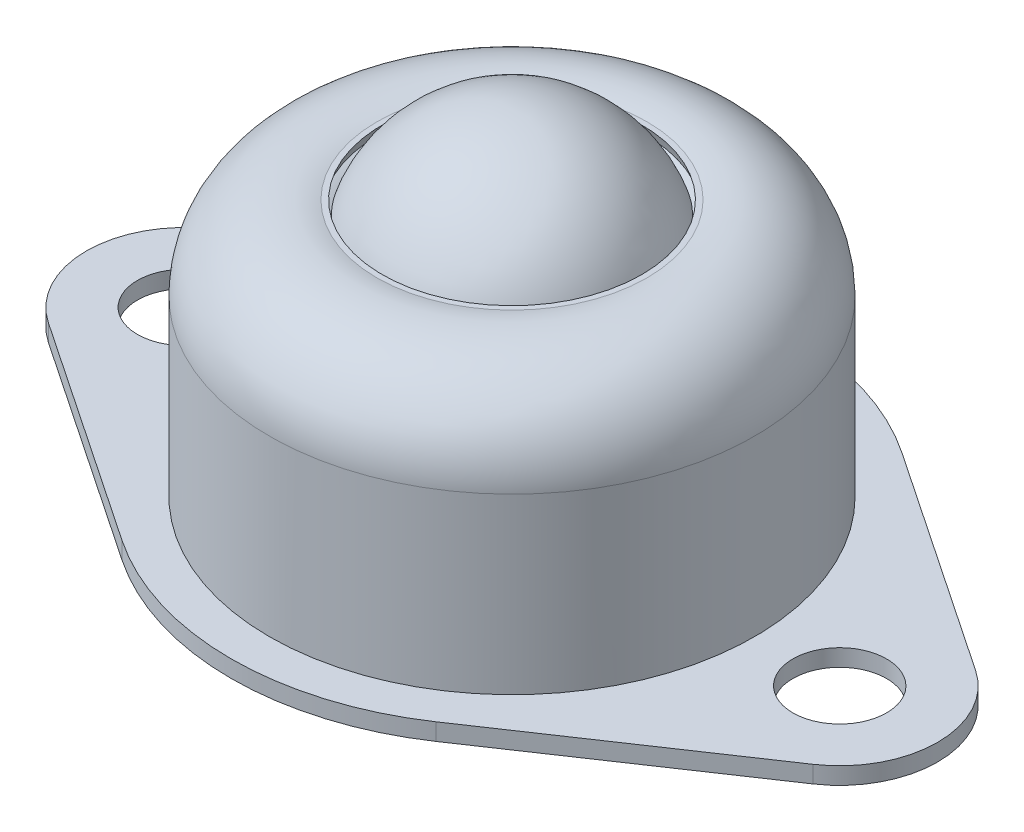
ISO-10303-21;
HEADER;
FILE_DESCRIPTION(('STEP AP214'),'2;1');
FILE_NAME('part.step','',(''),(''),'','','');
FILE_SCHEMA(('AUTOMOTIVE_DESIGN { 1 0 10303 214 1 1 1 1 }'));
ENDSEC;
DATA;
#1=APPLICATION_CONTEXT('core data for automotive mechanical design processes');
#2=APPLICATION_PROTOCOL_DEFINITION('international standard','automotive_design',2000,#1);
#3=PRODUCT_CONTEXT('',#1,'mechanical');
#4=PRODUCT('Part','Part','',(#3));
#5=PRODUCT_RELATED_PRODUCT_CATEGORY('part','',(#4));
#6=PRODUCT_DEFINITION_FORMATION('','',#4);
#7=PRODUCT_DEFINITION_CONTEXT('part definition',#1,'design');
#8=PRODUCT_DEFINITION('design','',#6,#7);
#9=PRODUCT_DEFINITION_SHAPE('','',#8);
#10=(LENGTH_UNIT() NAMED_UNIT(*) SI_UNIT(.MILLI.,.METRE.));
#11=(NAMED_UNIT(*) PLANE_ANGLE_UNIT() SI_UNIT($,.RADIAN.));
#12=(NAMED_UNIT(*) SI_UNIT($,.STERADIAN.) SOLID_ANGLE_UNIT());
#13=UNCERTAINTY_MEASURE_WITH_UNIT(LENGTH_MEASURE(1.E-05),#10,'distance_accuracy_value','');
#14=(GEOMETRIC_REPRESENTATION_CONTEXT(3) GLOBAL_UNCERTAINTY_ASSIGNED_CONTEXT((#13)) GLOBAL_UNIT_ASSIGNED_CONTEXT((#10,
#11,#12)) REPRESENTATION_CONTEXT('',''));
#15=CARTESIAN_POINT('',(0.,0.,0.));
#16=DIRECTION('',(0.,0.,1.));
#17=DIRECTION('',(1.,0.,0.));
#18=AXIS2_PLACEMENT_3D('',#15,#16,#17);
#19=CARTESIAN_POINT('',(0.,12.7625,0.));
#20=DIRECTION('',(0.,1.,0.));
#21=DIRECTION('',(1.,0.,0.));
#22=AXIS2_PLACEMENT_3D('',#19,#20,#21);
#23=SPHERICAL_SURFACE('',#22,7.9375);
#24=CARTESIAN_POINT('',(0.,20.7,0.));
#25=VERTEX_POINT('',#24);
#26=VERTEX_LOOP('',#25);
#27=FACE_BOUND('',#26,.T.);
#28=ADVANCED_FACE('F43',(#27),#23,.T.);
#29=CLOSED_SHELL('',(#28));
#30=MANIFOLD_SOLID_BREP('B2',#29);
#31=CARTESIAN_POINT('',(0.,1.,0.));
#32=DIRECTION('',(0.,1.,0.));
#33=DIRECTION('',(0.,0.,1.));
#34=AXIS2_PLACEMENT_3D('',#31,#32,#33);
#35=PLANE('',#34);
#36=CARTESIAN_POINT('',(0.,1.,0.));
#37=DIRECTION('',(0.,1.,0.));
#38=DIRECTION('',(0.,0.,1.));
#39=AXIS2_PLACEMENT_3D('',#36,#37,#38);
#40=CIRCLE('',#39,14.25);
#41=CARTESIAN_POINT('',(0.,1.,14.25));
#42=VERTEX_POINT('',#41);
#43=EDGE_CURVE('E212',#42,#42,#40,.F.);
#44=ORIENTED_EDGE('',*,*,#43,.T.);
#45=EDGE_LOOP('',(#44));
#46=FACE_BOUND('',#45,.T.);
#47=CARTESIAN_POINT('',(-19.25,1.,0.));
#48=DIRECTION('',(0.,1.,0.));
#49=DIRECTION('',(0.,0.,1.));
#50=AXIS2_PLACEMENT_3D('',#47,#48,#49);
#51=CIRCLE('',#50,2.75);
#52=CARTESIAN_POINT('',(-19.25,1.,2.75));
#53=VERTEX_POINT('',#52);
#54=EDGE_CURVE('E157',#53,#53,#51,.T.);
#55=ORIENTED_EDGE('',*,*,#54,.F.);
#56=EDGE_LOOP('',(#55));
#57=FACE_BOUND('',#56,.T.);
#58=CARTESIAN_POINT('',(0.,1.,0.));
#59=DIRECTION('',(0.,1.,0.));
#60=DIRECTION('',(0.,0.,1.));
#61=AXIS2_PLACEMENT_3D('',#58,#59,#60);
#62=CIRCLE('',#61,16.5);
#63=CARTESIAN_POINT('',(9.2142857142857,1.,-13.6874737908611));
#64=VERTEX_POINT('',#63);
#65=CARTESIAN_POINT('',(-9.2142857142857,1.,-13.6874737908611));
#66=VERTEX_POINT('',#65);
#67=EDGE_CURVE('E168',#64,#66,#62,.T.);
#68=ORIENTED_EDGE('',*,*,#67,.T.);
#69=DIRECTION('',(-0.829543866112796,0.,0.558441558441557));
#70=VECTOR('',#69,1.);
#71=CARTESIAN_POINT('',(-9.2142857142857,1.,-13.6874737908611));
#72=LINE('',#71,#70);
#73=CARTESIAN_POINT('',(-22.461038961039,1.,-4.76987723014859));
#74=VERTEX_POINT('',#73);
#75=EDGE_CURVE('E116',#66,#74,#72,.T.);
#76=ORIENTED_EDGE('',*,*,#75,.T.);
#77=CARTESIAN_POINT('',(-19.25,1.,0.));
#78=DIRECTION('',(0.,1.,0.));
#79=DIRECTION('',(0.,0.,1.));
#80=AXIS2_PLACEMENT_3D('',#77,#78,#79);
#81=CIRCLE('',#80,5.75000000000002);
#82=CARTESIAN_POINT('',(-22.461038961039,1.,4.76987723014859));
#83=VERTEX_POINT('',#82);
#84=EDGE_CURVE('E184',#74,#83,#81,.T.);
#85=ORIENTED_EDGE('',*,*,#84,.T.);
#86=DIRECTION('',(0.829543866112796,0.,0.558441558441557));
#87=VECTOR('',#86,1.);
#88=CARTESIAN_POINT('',(-22.461038961039,1.,4.76987723014859));
#89=LINE('',#88,#87);
#90=CARTESIAN_POINT('',(-9.2142857142857,1.,13.6874737908611));
#91=VERTEX_POINT('',#90);
#92=EDGE_CURVE('E197',#83,#91,#89,.T.);
#93=ORIENTED_EDGE('',*,*,#92,.T.);
#94=CARTESIAN_POINT('',(0.,1.,0.));
#95=DIRECTION('',(0.,1.,0.));
#96=DIRECTION('',(0.,0.,1.));
#97=AXIS2_PLACEMENT_3D('',#94,#95,#96);
#98=CIRCLE('',#97,16.5);
#99=CARTESIAN_POINT('',(9.2142857142857,1.,13.6874737908611));
#100=VERTEX_POINT('',#99);
#101=EDGE_CURVE('E135',#91,#100,#98,.T.);
#102=ORIENTED_EDGE('',*,*,#101,.T.);
#103=DIRECTION('',(0.829543866112796,0.,-0.558441558441557));
#104=VECTOR('',#103,1.);
#105=CARTESIAN_POINT('',(9.2142857142857,1.,13.6874737908611));
#106=LINE('',#105,#104);
#107=CARTESIAN_POINT('',(22.461038961039,1.,4.76987723014859));
#108=VERTEX_POINT('',#107);
#109=EDGE_CURVE('E129',#100,#108,#106,.T.);
#110=ORIENTED_EDGE('',*,*,#109,.T.);
#111=CARTESIAN_POINT('',(19.25,1.,0.));
#112=DIRECTION('',(0.,1.,0.));
#113=DIRECTION('',(0.,0.,-1.));
#114=AXIS2_PLACEMENT_3D('',#111,#112,#113);
#115=CIRCLE('',#114,5.75000000000002);
#116=CARTESIAN_POINT('',(22.461038961039,1.,-4.76987723014859));
#117=VERTEX_POINT('',#116);
#118=EDGE_CURVE('E133',#108,#117,#115,.T.);
#119=ORIENTED_EDGE('',*,*,#118,.T.);
#120=DIRECTION('',(-0.829543866112796,0.,-0.558441558441557));
#121=VECTOR('',#120,1.);
#122=CARTESIAN_POINT('',(22.461038961039,1.,-4.76987723014859));
#123=LINE('',#122,#121);
#124=EDGE_CURVE('E73',#117,#64,#123,.T.);
#125=ORIENTED_EDGE('',*,*,#124,.T.);
#126=EDGE_LOOP('',(#68,#76,#85,#93,#102,#110,#119,#125));
#127=FACE_BOUND('',#126,.T.);
#128=CARTESIAN_POINT('',(19.25,1.,0.));
#129=DIRECTION('',(0.,1.,0.));
#130=DIRECTION('',(0.,0.,1.));
#131=AXIS2_PLACEMENT_3D('',#128,#129,#130);
#132=CIRCLE('',#131,2.75);
#133=CARTESIAN_POINT('',(19.25,1.,2.75));
#134=VERTEX_POINT('',#133);
#135=EDGE_CURVE('E206',#134,#134,#132,.T.);
#136=ORIENTED_EDGE('',*,*,#135,.F.);
#137=EDGE_LOOP('',(#136));
#138=FACE_BOUND('',#137,.T.);
#139=ADVANCED_FACE('F55',(#46,#57,#127,#138),#35,.T.);
#140=CARTESIAN_POINT('',(0.,0.,0.));
#141=DIRECTION('',(0.,1.,0.));
#142=DIRECTION('',(0.,0.,1.));
#143=AXIS2_PLACEMENT_3D('',#140,#141,#142);
#144=PLANE('',#143);
#145=CARTESIAN_POINT('',(0.,0.,0.));
#146=DIRECTION('',(0.,1.,0.));
#147=DIRECTION('',(0.,0.,1.));
#148=AXIS2_PLACEMENT_3D('',#145,#146,#147);
#149=CIRCLE('',#148,16.5);
#150=CARTESIAN_POINT('',(9.2142857142857,0.,-13.6874737908611));
#151=VERTEX_POINT('',#150);
#152=CARTESIAN_POINT('',(-9.2142857142857,0.,-13.6874737908611));
#153=VERTEX_POINT('',#152);
#154=EDGE_CURVE('E153',#151,#153,#149,.T.);
#155=ORIENTED_EDGE('',*,*,#154,.F.);
#156=DIRECTION('',(-0.829543866112796,0.,-0.558441558441557));
#157=VECTOR('',#156,1.);
#158=CARTESIAN_POINT('',(22.461038961039,0.,-4.76987723014859));
#159=LINE('',#158,#157);
#160=CARTESIAN_POINT('',(22.461038961039,0.,-4.76987723014859));
#161=VERTEX_POINT('',#160);
#162=EDGE_CURVE('E108',#161,#151,#159,.T.);
#163=ORIENTED_EDGE('',*,*,#162,.F.);
#164=CARTESIAN_POINT('',(19.25,0.,0.));
#165=DIRECTION('',(0.,1.,0.));
#166=DIRECTION('',(0.,0.,-1.));
#167=AXIS2_PLACEMENT_3D('',#164,#165,#166);
#168=CIRCLE('',#167,5.75000000000002);
#169=CARTESIAN_POINT('',(22.461038961039,0.,4.76987723014859));
#170=VERTEX_POINT('',#169);
#171=EDGE_CURVE('E102',#170,#161,#168,.T.);
#172=ORIENTED_EDGE('',*,*,#171,.F.);
#173=DIRECTION('',(0.829543866112796,0.,-0.558441558441557));
#174=VECTOR('',#173,1.);
#175=CARTESIAN_POINT('',(9.2142857142857,0.,13.6874737908611));
#176=LINE('',#175,#174);
#177=CARTESIAN_POINT('',(9.2142857142857,0.,13.6874737908611));
#178=VERTEX_POINT('',#177);
#179=EDGE_CURVE('E143',#178,#170,#176,.T.);
#180=ORIENTED_EDGE('',*,*,#179,.F.);
#181=CARTESIAN_POINT('',(0.,0.,0.));
#182=DIRECTION('',(0.,1.,0.));
#183=DIRECTION('',(0.,0.,1.));
#184=AXIS2_PLACEMENT_3D('',#181,#182,#183);
#185=CIRCLE('',#184,16.5);
#186=CARTESIAN_POINT('',(-9.2142857142857,0.,13.6874737908611));
#187=VERTEX_POINT('',#186);
#188=EDGE_CURVE('E163',#187,#178,#185,.T.);
#189=ORIENTED_EDGE('',*,*,#188,.F.);
#190=DIRECTION('',(0.829543866112796,0.,0.558441558441557));
#191=VECTOR('',#190,1.);
#192=CARTESIAN_POINT('',(-22.461038961039,0.,4.76987723014859));
#193=LINE('',#192,#191);
#194=CARTESIAN_POINT('',(-22.461038961039,0.,4.76987723014859));
#195=VERTEX_POINT('',#194);
#196=EDGE_CURVE('E161',#195,#187,#193,.T.);
#197=ORIENTED_EDGE('',*,*,#196,.F.);
#198=CARTESIAN_POINT('',(-19.25,0.,0.));
#199=DIRECTION('',(0.,1.,0.));
#200=DIRECTION('',(0.,0.,1.));
#201=AXIS2_PLACEMENT_3D('',#198,#199,#200);
#202=CIRCLE('',#201,5.75000000000002);
#203=CARTESIAN_POINT('',(-22.461038961039,0.,-4.76987723014859));
#204=VERTEX_POINT('',#203);
#205=EDGE_CURVE('E159',#204,#195,#202,.T.);
#206=ORIENTED_EDGE('',*,*,#205,.F.);
#207=DIRECTION('',(-0.829543866112796,0.,0.558441558441557));
#208=VECTOR('',#207,1.);
#209=CARTESIAN_POINT('',(-9.2142857142857,0.,-13.6874737908611));
#210=LINE('',#209,#208);
#211=EDGE_CURVE('E156',#153,#204,#210,.T.);
#212=ORIENTED_EDGE('',*,*,#211,.F.);
#213=EDGE_LOOP('',(#155,#163,#172,#180,#189,#197,#206,#212));
#214=FACE_BOUND('',#213,.T.);
#215=CARTESIAN_POINT('',(19.25,0.,0.));
#216=DIRECTION('',(0.,1.,0.));
#217=DIRECTION('',(0.,0.,1.));
#218=AXIS2_PLACEMENT_3D('',#215,#216,#217);
#219=CIRCLE('',#218,2.75);
#220=CARTESIAN_POINT('',(19.25,0.,2.75));
#221=VERTEX_POINT('',#220);
#222=EDGE_CURVE('E209',#221,#221,#219,.T.);
#223=ORIENTED_EDGE('',*,*,#222,.T.);
#224=EDGE_LOOP('',(#223));
#225=FACE_BOUND('',#224,.T.);
#226=CARTESIAN_POINT('',(0.,0.,0.));
#227=DIRECTION('',(0.,1.,0.));
#228=DIRECTION('',(0.,0.,1.));
#229=AXIS2_PLACEMENT_3D('',#226,#227,#228);
#230=CIRCLE('',#229,13.65);
#231=CARTESIAN_POINT('',(0.,0.,13.65));
#232=VERTEX_POINT('',#231);
#233=EDGE_CURVE('E227',#232,#232,#230,.T.);
#234=ORIENTED_EDGE('',*,*,#233,.T.);
#235=EDGE_LOOP('',(#234));
#236=FACE_BOUND('',#235,.T.);
#237=CARTESIAN_POINT('',(-19.25,0.,0.));
#238=DIRECTION('',(0.,1.,0.));
#239=DIRECTION('',(0.,0.,1.));
#240=AXIS2_PLACEMENT_3D('',#237,#238,#239);
#241=CIRCLE('',#240,2.75);
#242=CARTESIAN_POINT('',(-19.25,0.,2.75));
#243=VERTEX_POINT('',#242);
#244=EDGE_CURVE('E203',#243,#243,#241,.T.);
#245=ORIENTED_EDGE('',*,*,#244,.T.);
#246=EDGE_LOOP('',(#245));
#247=FACE_BOUND('',#246,.T.);
#248=ADVANCED_FACE('F188',(#214,#225,#236,#247),#144,.F.);
#249=CARTESIAN_POINT('',(0.,1.,0.));
#250=DIRECTION('',(0.,-1.,0.));
#251=DIRECTION('',(0.,0.,-1.));
#252=AXIS2_PLACEMENT_3D('',#249,#250,#251);
#253=CYLINDRICAL_SURFACE('',#252,16.5);
#254=ORIENTED_EDGE('',*,*,#154,.T.);
#255=DIRECTION('',(0.,-1.,0.));
#256=VECTOR('',#255,1.);
#257=CARTESIAN_POINT('',(-9.2142857142857,1.,-13.6874737908611));
#258=LINE('',#257,#256);
#259=EDGE_CURVE('E41',#66,#153,#258,.T.);
#260=ORIENTED_EDGE('',*,*,#259,.F.);
#261=ORIENTED_EDGE('',*,*,#67,.F.);
#262=DIRECTION('',(0.,-1.,0.));
#263=VECTOR('',#262,1.);
#264=CARTESIAN_POINT('',(9.2142857142857,1.,-13.6874737908611));
#265=LINE('',#264,#263);
#266=EDGE_CURVE('E149',#64,#151,#265,.T.);
#267=ORIENTED_EDGE('',*,*,#266,.T.);
#268=EDGE_LOOP('',(#254,#260,#261,#267));
#269=FACE_BOUND('',#268,.T.);
#270=ADVANCED_FACE('F253',(#269),#253,.T.);
#271=CARTESIAN_POINT('',(-9.2142857142857,1.,-13.6874737908611));
#272=DIRECTION('',(0.558441558441558,0.,0.829543866112796));
#273=DIRECTION('',(0.829543866112796,0.,-0.558441558441558));
#274=AXIS2_PLACEMENT_3D('',#271,#272,#273);
#275=PLANE('',#274);
#276=ORIENTED_EDGE('',*,*,#211,.T.);
#277=DIRECTION('',(0.,-1.,0.));
#278=VECTOR('',#277,1.);
#279=CARTESIAN_POINT('',(-22.461038961039,1.,-4.76987723014859));
#280=LINE('',#279,#278);
#281=EDGE_CURVE('E65',#74,#204,#280,.T.);
#282=ORIENTED_EDGE('',*,*,#281,.F.);
#283=ORIENTED_EDGE('',*,*,#75,.F.);
#284=ORIENTED_EDGE('',*,*,#259,.T.);
#285=EDGE_LOOP('',(#276,#282,#283,#284));
#286=FACE_BOUND('',#285,.T.);
#287=ADVANCED_FACE('F273',(#286),#275,.F.);
#288=CARTESIAN_POINT('',(-19.25,1.,0.));
#289=DIRECTION('',(0.,-1.,0.));
#290=DIRECTION('',(0.,0.,-1.));
#291=AXIS2_PLACEMENT_3D('',#288,#289,#290);
#292=CYLINDRICAL_SURFACE('',#291,5.75000000000002);
#293=ORIENTED_EDGE('',*,*,#205,.T.);
#294=DIRECTION('',(0.,-1.,0.));
#295=VECTOR('',#294,1.);
#296=CARTESIAN_POINT('',(-22.461038961039,1.,4.76987723014859));
#297=LINE('',#296,#295);
#298=EDGE_CURVE('E175',#83,#195,#297,.T.);
#299=ORIENTED_EDGE('',*,*,#298,.F.);
#300=ORIENTED_EDGE('',*,*,#84,.F.);
#301=ORIENTED_EDGE('',*,*,#281,.T.);
#302=EDGE_LOOP('',(#293,#299,#300,#301));
#303=FACE_BOUND('',#302,.T.);
#304=ADVANCED_FACE('F182',(#303),#292,.T.);
#305=CARTESIAN_POINT('',(-22.461038961039,1.,4.76987723014859));
#306=DIRECTION('',(0.558441558441558,0.,-0.829543866112796));
#307=DIRECTION('',(-0.829543866112796,0.,-0.558441558441558));
#308=AXIS2_PLACEMENT_3D('',#305,#306,#307);
#309=PLANE('',#308);
#310=ORIENTED_EDGE('',*,*,#196,.T.);
#311=DIRECTION('',(0.,-1.,0.));
#312=VECTOR('',#311,1.);
#313=CARTESIAN_POINT('',(-9.2142857142857,1.,13.6874737908611));
#314=LINE('',#313,#312);
#315=EDGE_CURVE('E172',#91,#187,#314,.T.);
#316=ORIENTED_EDGE('',*,*,#315,.F.);
#317=ORIENTED_EDGE('',*,*,#92,.F.);
#318=ORIENTED_EDGE('',*,*,#298,.T.);
#319=EDGE_LOOP('',(#310,#316,#317,#318));
#320=FACE_BOUND('',#319,.T.);
#321=ADVANCED_FACE('F193',(#320),#309,.F.);
#322=CARTESIAN_POINT('',(0.,1.,0.));
#323=DIRECTION('',(0.,-1.,0.));
#324=DIRECTION('',(0.,0.,-1.));
#325=AXIS2_PLACEMENT_3D('',#322,#323,#324);
#326=CYLINDRICAL_SURFACE('',#325,16.5);
#327=ORIENTED_EDGE('',*,*,#188,.T.);
#328=DIRECTION('',(0.,-1.,0.));
#329=VECTOR('',#328,1.);
#330=CARTESIAN_POINT('',(9.2142857142857,1.,13.6874737908611));
#331=LINE('',#330,#329);
#332=EDGE_CURVE('E144',#100,#178,#331,.T.);
#333=ORIENTED_EDGE('',*,*,#332,.F.);
#334=ORIENTED_EDGE('',*,*,#101,.F.);
#335=ORIENTED_EDGE('',*,*,#315,.T.);
#336=EDGE_LOOP('',(#327,#333,#334,#335));
#337=FACE_BOUND('',#336,.T.);
#338=ADVANCED_FACE('F196',(#337),#326,.T.);
#339=CARTESIAN_POINT('',(9.2142857142857,1.,13.6874737908611));
#340=DIRECTION('',(-0.558441558441558,0.,-0.829543866112796));
#341=DIRECTION('',(-0.829543866112796,0.,0.558441558441558));
#342=AXIS2_PLACEMENT_3D('',#339,#340,#341);
#343=PLANE('',#342);
#344=ORIENTED_EDGE('',*,*,#179,.T.);
#345=DIRECTION('',(0.,-1.,0.));
#346=VECTOR('',#345,1.);
#347=CARTESIAN_POINT('',(22.461038961039,1.,4.76987723014859));
#348=LINE('',#347,#346);
#349=EDGE_CURVE('E140',#108,#170,#348,.T.);
#350=ORIENTED_EDGE('',*,*,#349,.F.);
#351=ORIENTED_EDGE('',*,*,#109,.F.);
#352=ORIENTED_EDGE('',*,*,#332,.T.);
#353=EDGE_LOOP('',(#344,#350,#351,#352));
#354=FACE_BOUND('',#353,.T.);
#355=ADVANCED_FACE('F141',(#354),#343,.F.);
#356=CARTESIAN_POINT('',(19.25,1.,0.));
#357=DIRECTION('',(0.,-1.,0.));
#358=DIRECTION('',(0.,0.,-1.));
#359=AXIS2_PLACEMENT_3D('',#356,#357,#358);
#360=CYLINDRICAL_SURFACE('',#359,5.75000000000002);
#361=ORIENTED_EDGE('',*,*,#171,.T.);
#362=DIRECTION('',(0.,-1.,0.));
#363=VECTOR('',#362,1.);
#364=CARTESIAN_POINT('',(22.461038961039,1.,-4.76987723014859));
#365=LINE('',#364,#363);
#366=EDGE_CURVE('E145',#117,#161,#365,.T.);
#367=ORIENTED_EDGE('',*,*,#366,.F.);
#368=ORIENTED_EDGE('',*,*,#118,.F.);
#369=ORIENTED_EDGE('',*,*,#349,.T.);
#370=EDGE_LOOP('',(#361,#367,#368,#369));
#371=FACE_BOUND('',#370,.T.);
#372=ADVANCED_FACE('F147',(#371),#360,.T.);
#373=CARTESIAN_POINT('',(22.461038961039,1.,-4.76987723014859));
#374=DIRECTION('',(-0.558441558441558,0.,0.829543866112796));
#375=DIRECTION('',(0.829543866112796,0.,0.558441558441558));
#376=AXIS2_PLACEMENT_3D('',#373,#374,#375);
#377=PLANE('',#376);
#378=ORIENTED_EDGE('',*,*,#162,.T.);
#379=ORIENTED_EDGE('',*,*,#266,.F.);
#380=ORIENTED_EDGE('',*,*,#124,.F.);
#381=ORIENTED_EDGE('',*,*,#366,.T.);
#382=EDGE_LOOP('',(#378,#379,#380,#381));
#383=FACE_BOUND('',#382,.T.);
#384=ADVANCED_FACE('F260',(#383),#377,.F.);
#385=CARTESIAN_POINT('',(-19.25,1.,0.));
#386=DIRECTION('',(0.,-1.,0.));
#387=DIRECTION('',(0.,0.,-1.));
#388=AXIS2_PLACEMENT_3D('',#385,#386,#387);
#389=CYLINDRICAL_SURFACE('',#388,2.75);
#390=ORIENTED_EDGE('',*,*,#54,.T.);
#391=EDGE_LOOP('',(#390));
#392=FACE_BOUND('',#391,.T.);
#393=ORIENTED_EDGE('',*,*,#244,.F.);
#394=EDGE_LOOP('',(#393));
#395=FACE_BOUND('',#394,.T.);
#396=ADVANCED_FACE('F257',(#392,#395),#389,.F.);
#397=CARTESIAN_POINT('',(19.25,1.,0.));
#398=DIRECTION('',(0.,-1.,0.));
#399=DIRECTION('',(0.,0.,-1.));
#400=AXIS2_PLACEMENT_3D('',#397,#398,#399);
#401=CYLINDRICAL_SURFACE('',#400,2.75);
#402=ORIENTED_EDGE('',*,*,#135,.T.);
#403=EDGE_LOOP('',(#402));
#404=FACE_BOUND('',#403,.T.);
#405=ORIENTED_EDGE('',*,*,#222,.F.);
#406=EDGE_LOOP('',(#405));
#407=FACE_BOUND('',#406,.T.);
#408=ADVANCED_FACE('F317',(#404,#407),#401,.F.);
#409=CARTESIAN_POINT('',(0.,11.2,0.));
#410=DIRECTION('',(0.,1.,0.));
#411=DIRECTION('',(-1.,0.,0.));
#412=AXIS2_PLACEMENT_3D('',#409,#410,#411);
#413=TOROIDAL_SURFACE('',#412,9.19196782178218,5.05803217821783);
#414=CARTESIAN_POINT('',(0.,16.1,0.));
#415=DIRECTION('',(0.,1.,0.));
#416=DIRECTION('',(-1.,0.,0.));
#417=AXIS2_PLACEMENT_3D('',#414,#415,#416);
#418=CIRCLE('',#417,7.9375);
#419=CARTESIAN_POINT('',(-7.9375,16.1,0.));
#420=VERTEX_POINT('',#419);
#421=EDGE_CURVE('E220',#420,#420,#418,.T.);
#422=ORIENTED_EDGE('',*,*,#421,.F.);
#423=EDGE_LOOP('',(#422));
#424=FACE_BOUND('',#423,.T.);
#425=CARTESIAN_POINT('',(0.,11.2,0.));
#426=DIRECTION('',(0.,1.,0.));
#427=DIRECTION('',(-1.,0.,0.));
#428=AXIS2_PLACEMENT_3D('',#425,#426,#427);
#429=CIRCLE('',#428,14.25);
#430=CARTESIAN_POINT('',(-14.25,11.2,0.));
#431=VERTEX_POINT('',#430);
#432=EDGE_CURVE('E217',#431,#431,#429,.T.);
#433=ORIENTED_EDGE('',*,*,#432,.T.);
#434=EDGE_LOOP('',(#433));
#435=FACE_BOUND('',#434,.T.);
#436=ADVANCED_FACE('F324',(#424,#435),#413,.T.);
#437=CARTESIAN_POINT('',(0.,16.1,0.));
#438=DIRECTION('',(0.,1.,0.));
#439=DIRECTION('',(-1.,0.,0.));
#440=AXIS2_PLACEMENT_3D('',#437,#438,#439);
#441=CYLINDRICAL_SURFACE('',#440,14.25);
#442=ORIENTED_EDGE('',*,*,#43,.F.);
#443=EDGE_LOOP('',(#442));
#444=FACE_BOUND('',#443,.T.);
#445=ORIENTED_EDGE('',*,*,#432,.F.);
#446=EDGE_LOOP('',(#445));
#447=FACE_BOUND('',#446,.T.);
#448=ADVANCED_FACE('F331',(#444,#447),#441,.T.);
#449=CARTESIAN_POINT('',(-7.9375,16.1,0.));
#450=DIRECTION('',(0.,-1.,0.));
#451=DIRECTION('',(1.,0.,0.));
#452=AXIS2_PLACEMENT_3D('',#449,#450,#451);
#453=PLANE('',#452);
#454=CARTESIAN_POINT('',(0.,16.1,0.));
#455=DIRECTION('',(0.,-1.,0.));
#456=DIRECTION('',(1.,0.,0.));
#457=AXIS2_PLACEMENT_3D('',#454,#455,#456);
#458=CIRCLE('',#457,7.61961521338184);
#459=CARTESIAN_POINT('',(7.61961521338183,16.1,0.));
#460=VERTEX_POINT('',#459);
#461=EDGE_CURVE('E59',#460,#460,#458,.F.);
#462=ORIENTED_EDGE('',*,*,#461,.F.);
#463=EDGE_LOOP('',(#462));
#464=FACE_BOUND('',#463,.T.);
#465=ORIENTED_EDGE('',*,*,#421,.T.);
#466=EDGE_LOOP('',(#465));
#467=FACE_BOUND('',#466,.T.);
#468=ADVANCED_FACE('F339',(#464,#467),#453,.F.);
#469=CARTESIAN_POINT('',(0.,12.7625,0.));
#470=DIRECTION('',(0.,1.,0.));
#471=DIRECTION('',(1.,0.,0.));
#472=AXIS2_PLACEMENT_3D('',#469,#470,#471);
#473=SPHERICAL_SURFACE('',#472,8.3185);
#474=ORIENTED_EDGE('',*,*,#461,.T.);
#475=EDGE_LOOP('',(#474));
#476=FACE_BOUND('',#475,.T.);
#477=ADVANCED_FACE('F57',(#476),#473,.F.);
#478=CARTESIAN_POINT('',(0.,12.7625,0.));
#479=DIRECTION('',(0.,1.,0.));
#480=DIRECTION('',(1.,0.,0.));
#481=AXIS2_PLACEMENT_3D('',#478,#479,#480);
#482=SPHERICAL_SURFACE('',#481,8.9185);
#483=CARTESIAN_POINT('',(0.,7.29321979463565,0.));
#484=DIRECTION('',(0.,-1.,0.));
#485=DIRECTION('',(1.,0.,0.));
#486=AXIS2_PLACEMENT_3D('',#483,#484,#485);
#487=CIRCLE('',#486,7.0446161205001);
#488=CARTESIAN_POINT('',(7.04461612050011,7.29321979463567,0.));
#489=VERTEX_POINT('',#488);
#490=EDGE_CURVE('E223',#489,#489,#487,.F.);
#491=ORIENTED_EDGE('',*,*,#490,.F.);
#492=EDGE_LOOP('',(#491));
#493=FACE_BOUND('',#492,.T.);
#494=ADVANCED_FACE('F243',(#493),#482,.T.);
#495=CARTESIAN_POINT('',(0.,11.2,0.));
#496=DIRECTION('',(0.,1.,0.));
#497=DIRECTION('',(-1.,0.,0.));
#498=AXIS2_PLACEMENT_3D('',#495,#496,#497);
#499=TOROIDAL_SURFACE('',#498,9.19196782178218,4.45803217821783);
#500=CARTESIAN_POINT('',(0.,11.2,0.));
#501=DIRECTION('',(0.,1.,0.));
#502=DIRECTION('',(-1.,0.,0.));
#503=AXIS2_PLACEMENT_3D('',#500,#501,#502);
#504=CIRCLE('',#503,13.65);
#505=CARTESIAN_POINT('',(-13.65,11.2,0.));
#506=VERTEX_POINT('',#505);
#507=EDGE_CURVE('E226',#506,#506,#504,.T.);
#508=ORIENTED_EDGE('',*,*,#507,.F.);
#509=EDGE_LOOP('',(#508));
#510=FACE_BOUND('',#509,.T.);
#511=ORIENTED_EDGE('',*,*,#490,.T.);
#512=EDGE_LOOP('',(#511));
#513=FACE_BOUND('',#512,.T.);
#514=ADVANCED_FACE('F237',(#510,#513),#499,.F.);
#515=CARTESIAN_POINT('',(0.,16.1,0.));
#516=DIRECTION('',(0.,1.,0.));
#517=DIRECTION('',(-1.,0.,0.));
#518=AXIS2_PLACEMENT_3D('',#515,#516,#517);
#519=CYLINDRICAL_SURFACE('',#518,13.65);
#520=ORIENTED_EDGE('',*,*,#507,.T.);
#521=EDGE_LOOP('',(#520));
#522=FACE_BOUND('',#521,.T.);
#523=ORIENTED_EDGE('',*,*,#233,.F.);
#524=EDGE_LOOP('',(#523));
#525=FACE_BOUND('',#524,.T.);
#526=ADVANCED_FACE('F235',(#522,#525),#519,.F.);
#527=CLOSED_SHELL('',(#139,#248,#270,#287,#304,#321,#338,#355,#372,#384,#396,#408,#436,#448,
#468,#477,#494,#514,#526));
#528=MANIFOLD_SOLID_BREP('B7',#527);
#529=ADVANCED_BREP_SHAPE_REPRESENTATION('',(#18,#30,#528),#14);
#530=SHAPE_DEFINITION_REPRESENTATION(#9,#529);
ENDSEC;
END-ISO-10303-21;
